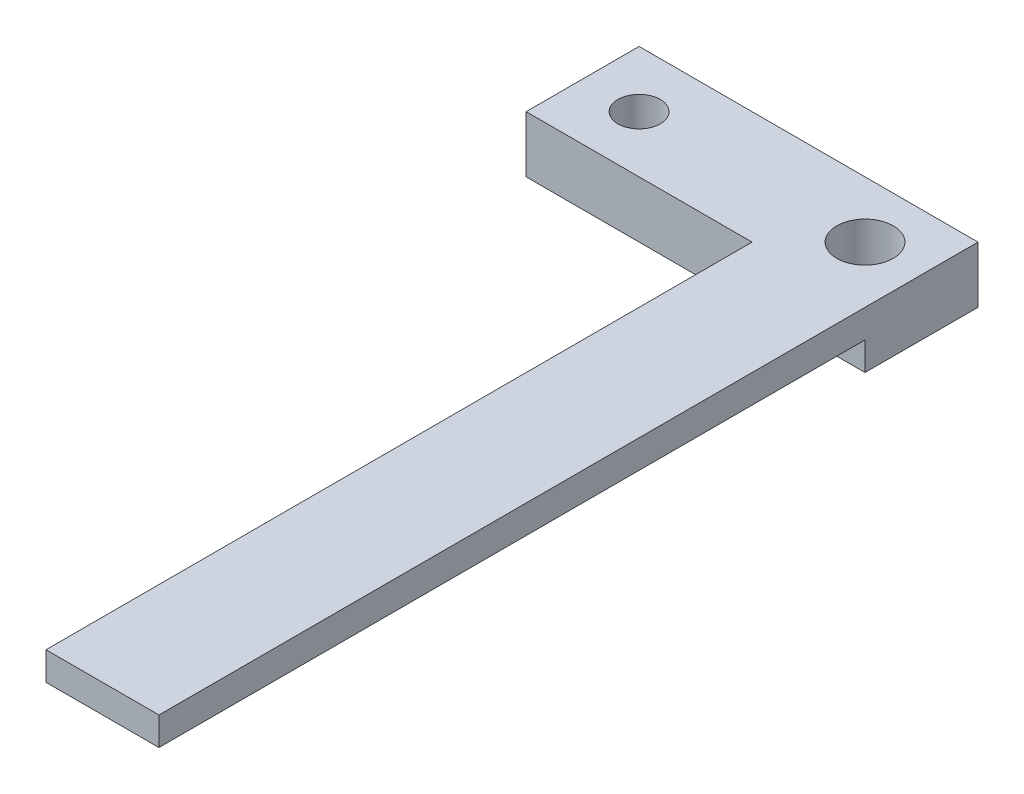
ISO-10303-21;
HEADER;
FILE_DESCRIPTION(('STEP AP214'),'2;1');
FILE_NAME('part.step','',(''),(''),'','','');
FILE_SCHEMA(('AUTOMOTIVE_DESIGN { 1 0 10303 214 1 1 1 1 }'));
ENDSEC;
DATA;
#1=APPLICATION_CONTEXT('core data for automotive mechanical design processes');
#2=APPLICATION_PROTOCOL_DEFINITION('international standard','automotive_design',2000,#1);
#3=PRODUCT_CONTEXT('',#1,'mechanical');
#4=PRODUCT('Part','Part','',(#3));
#5=PRODUCT_RELATED_PRODUCT_CATEGORY('part','',(#4));
#6=PRODUCT_DEFINITION_FORMATION('','',#4);
#7=PRODUCT_DEFINITION_CONTEXT('part definition',#1,'design');
#8=PRODUCT_DEFINITION('design','',#6,#7);
#9=PRODUCT_DEFINITION_SHAPE('','',#8);
#10=(LENGTH_UNIT() NAMED_UNIT(*) SI_UNIT(.MILLI.,.METRE.));
#11=(NAMED_UNIT(*) PLANE_ANGLE_UNIT() SI_UNIT($,.RADIAN.));
#12=(NAMED_UNIT(*) SI_UNIT($,.STERADIAN.) SOLID_ANGLE_UNIT());
#13=UNCERTAINTY_MEASURE_WITH_UNIT(LENGTH_MEASURE(1.E-05),#10,'distance_accuracy_value','');
#14=(GEOMETRIC_REPRESENTATION_CONTEXT(3) GLOBAL_UNCERTAINTY_ASSIGNED_CONTEXT((#13)) GLOBAL_UNIT_ASSIGNED_CONTEXT((#10,
#11,#12)) REPRESENTATION_CONTEXT('',''));
#15=CARTESIAN_POINT('',(0.,0.,0.));
#16=DIRECTION('',(0.,0.,1.));
#17=DIRECTION('',(1.,0.,0.));
#18=AXIS2_PLACEMENT_3D('',#15,#16,#17);
#19=CARTESIAN_POINT('',(-60.,20.,20.));
#20=DIRECTION('',(0.,0.,-1.));
#21=DIRECTION('',(-1.,0.,0.));
#22=AXIS2_PLACEMENT_3D('',#19,#20,#21);
#23=PLANE('',#22);
#24=DIRECTION('',(1.,0.,0.));
#25=VECTOR('',#24,1.);
#26=CARTESIAN_POINT('',(20.,10.,20.));
#27=LINE('',#26,#25);
#28=CARTESIAN_POINT('',(20.,10.,20.));
#29=VERTEX_POINT('',#28);
#30=CARTESIAN_POINT('',(60.,10.,20.));
#31=VERTEX_POINT('',#30);
#32=EDGE_CURVE('E132',#29,#31,#27,.T.);
#33=ORIENTED_EDGE('',*,*,#32,.F.);
#34=DIRECTION('',(0.,-1.,0.));
#35=VECTOR('',#34,1.);
#36=CARTESIAN_POINT('',(20.,10.,20.));
#37=LINE('',#36,#35);
#38=CARTESIAN_POINT('',(20.,20.,20.));
#39=VERTEX_POINT('',#38);
#40=EDGE_CURVE('E60',#39,#29,#37,.T.);
#41=ORIENTED_EDGE('',*,*,#40,.F.);
#42=DIRECTION('',(1.,0.,0.));
#43=VECTOR('',#42,1.);
#44=CARTESIAN_POINT('',(-60.,20.,20.));
#45=LINE('',#44,#43);
#46=CARTESIAN_POINT('',(-60.,20.,20.));
#47=VERTEX_POINT('',#46);
#48=EDGE_CURVE('E182',#47,#39,#45,.T.);
#49=ORIENTED_EDGE('',*,*,#48,.F.);
#50=DIRECTION('',(0.,-1.,0.));
#51=VECTOR('',#50,1.);
#52=CARTESIAN_POINT('',(-60.,20.,20.));
#53=LINE('',#52,#51);
#54=CARTESIAN_POINT('',(-60.,0.,20.));
#55=VERTEX_POINT('',#54);
#56=EDGE_CURVE('E197',#47,#55,#53,.T.);
#57=ORIENTED_EDGE('',*,*,#56,.T.);
#58=DIRECTION('',(1.,0.,0.));
#59=VECTOR('',#58,1.);
#60=CARTESIAN_POINT('',(-60.,0.,20.));
#61=LINE('',#60,#59);
#62=CARTESIAN_POINT('',(60.,0.,20.));
#63=VERTEX_POINT('',#62);
#64=EDGE_CURVE('E114',#55,#63,#61,.T.);
#65=ORIENTED_EDGE('',*,*,#64,.T.);
#66=DIRECTION('',(0.,-1.,0.));
#67=VECTOR('',#66,1.);
#68=CARTESIAN_POINT('',(60.,20.,20.));
#69=LINE('',#68,#67);
#70=EDGE_CURVE('E66',#31,#63,#69,.T.);
#71=ORIENTED_EDGE('',*,*,#70,.F.);
#72=EDGE_LOOP('',(#33,#41,#49,#57,#65,#71));
#73=FACE_BOUND('',#72,.T.);
#74=ADVANCED_FACE('F44',(#73),#23,.F.);
#75=CARTESIAN_POINT('',(0.,0.,0.));
#76=DIRECTION('',(0.,-1.,0.));
#77=DIRECTION('',(0.,0.,-1.));
#78=AXIS2_PLACEMENT_3D('',#75,#76,#77);
#79=PLANE('',#78);
#80=CARTESIAN_POINT('',(40.,0.,0.));
#81=DIRECTION('',(0.,1.,0.));
#82=DIRECTION('',(0.,0.,1.));
#83=AXIS2_PLACEMENT_3D('',#80,#81,#82);
#84=CIRCLE('',#83,10.);
#85=CARTESIAN_POINT('',(40.,0.,10.));
#86=VERTEX_POINT('',#85);
#87=EDGE_CURVE('E161',#86,#86,#84,.T.);
#88=ORIENTED_EDGE('',*,*,#87,.T.);
#89=EDGE_LOOP('',(#88));
#90=FACE_BOUND('',#89,.T.);
#91=DIRECTION('',(0.,0.,-1.));
#92=VECTOR('',#91,1.);
#93=CARTESIAN_POINT('',(60.,0.,20.));
#94=LINE('',#93,#92);
#95=CARTESIAN_POINT('',(60.,0.,-20.));
#96=VERTEX_POINT('',#95);
#97=EDGE_CURVE('E175',#63,#96,#94,.T.);
#98=ORIENTED_EDGE('',*,*,#97,.F.);
#99=ORIENTED_EDGE('',*,*,#64,.F.);
#100=DIRECTION('',(0.,0.,1.));
#101=VECTOR('',#100,1.);
#102=CARTESIAN_POINT('',(-60.,0.,20.));
#103=LINE('',#102,#101);
#104=CARTESIAN_POINT('',(-60.,0.,-20.));
#105=VERTEX_POINT('',#104);
#106=EDGE_CURVE('E190',#105,#55,#103,.T.);
#107=ORIENTED_EDGE('',*,*,#106,.F.);
#108=DIRECTION('',(-1.,0.,0.));
#109=VECTOR('',#108,1.);
#110=CARTESIAN_POINT('',(-60.,0.,-20.));
#111=LINE('',#110,#109);
#112=EDGE_CURVE('E187',#96,#105,#111,.T.);
#113=ORIENTED_EDGE('',*,*,#112,.F.);
#114=EDGE_LOOP('',(#98,#99,#107,#113));
#115=FACE_BOUND('',#114,.T.);
#116=CARTESIAN_POINT('',(-40.,0.,0.));
#117=DIRECTION('',(0.,-1.,0.));
#118=DIRECTION('',(0.,0.,-1.));
#119=AXIS2_PLACEMENT_3D('',#116,#117,#118);
#120=CIRCLE('',#119,10.);
#121=CARTESIAN_POINT('',(-40.,0.,-10.));
#122=VERTEX_POINT('',#121);
#123=EDGE_CURVE('E156',#122,#122,#120,.T.);
#124=ORIENTED_EDGE('',*,*,#123,.F.);
#125=EDGE_LOOP('',(#124));
#126=FACE_BOUND('',#125,.T.);
#127=ADVANCED_FACE('F212',(#90,#115,#126),#79,.T.);
#128=CARTESIAN_POINT('',(0.,20.,0.));
#129=DIRECTION('',(0.,-1.,0.));
#130=DIRECTION('',(0.,0.,-1.));
#131=AXIS2_PLACEMENT_3D('',#128,#129,#130);
#132=PLANE('',#131);
#133=DIRECTION('',(0.,0.,-1.));
#134=VECTOR('',#133,1.);
#135=CARTESIAN_POINT('',(60.,20.,20.));
#136=LINE('',#135,#134);
#137=CARTESIAN_POINT('',(60.,20.,270.));
#138=VERTEX_POINT('',#137);
#139=CARTESIAN_POINT('',(60.,20.,-20.));
#140=VERTEX_POINT('',#139);
#141=EDGE_CURVE('E105',#138,#140,#136,.T.);
#142=ORIENTED_EDGE('',*,*,#141,.T.);
#143=DIRECTION('',(-1.,0.,0.));
#144=VECTOR('',#143,1.);
#145=CARTESIAN_POINT('',(-60.,20.,-20.));
#146=LINE('',#145,#144);
#147=CARTESIAN_POINT('',(-60.,20.,-20.));
#148=VERTEX_POINT('',#147);
#149=EDGE_CURVE('E113',#140,#148,#146,.T.);
#150=ORIENTED_EDGE('',*,*,#149,.T.);
#151=DIRECTION('',(0.,0.,1.));
#152=VECTOR('',#151,1.);
#153=CARTESIAN_POINT('',(-60.,20.,20.));
#154=LINE('',#153,#152);
#155=EDGE_CURVE('E179',#148,#47,#154,.T.);
#156=ORIENTED_EDGE('',*,*,#155,.T.);
#157=ORIENTED_EDGE('',*,*,#48,.T.);
#158=DIRECTION('',(0.,0.,-1.));
#159=VECTOR('',#158,1.);
#160=CARTESIAN_POINT('',(20.,20.,270.));
#161=LINE('',#160,#159);
#162=CARTESIAN_POINT('',(20.,20.,270.));
#163=VERTEX_POINT('',#162);
#164=EDGE_CURVE('E121',#163,#39,#161,.T.);
#165=ORIENTED_EDGE('',*,*,#164,.F.);
#166=DIRECTION('',(-1.,0.,0.));
#167=VECTOR('',#166,1.);
#168=CARTESIAN_POINT('',(20.,20.,270.));
#169=LINE('',#168,#167);
#170=EDGE_CURVE('E117',#138,#163,#169,.T.);
#171=ORIENTED_EDGE('',*,*,#170,.F.);
#172=EDGE_LOOP('',(#142,#150,#156,#157,#165,#171));
#173=FACE_BOUND('',#172,.T.);
#174=CARTESIAN_POINT('',(-40.,20.,0.));
#175=DIRECTION('',(0.,1.,0.));
#176=DIRECTION('',(0.,0.,1.));
#177=AXIS2_PLACEMENT_3D('',#174,#175,#176);
#178=CIRCLE('',#177,7.50000000000001);
#179=CARTESIAN_POINT('',(-40.,20.,7.50000000000001));
#180=VERTEX_POINT('',#179);
#181=EDGE_CURVE('E169',#180,#180,#178,.T.);
#182=ORIENTED_EDGE('',*,*,#181,.F.);
#183=EDGE_LOOP('',(#182));
#184=FACE_BOUND('',#183,.T.);
#185=CARTESIAN_POINT('',(40.,20.,0.));
#186=DIRECTION('',(0.,1.,0.));
#187=DIRECTION('',(0.,0.,1.));
#188=AXIS2_PLACEMENT_3D('',#185,#186,#187);
#189=CIRCLE('',#188,10.);
#190=CARTESIAN_POINT('',(40.,20.,10.));
#191=VERTEX_POINT('',#190);
#192=EDGE_CURVE('E165',#191,#191,#189,.T.);
#193=ORIENTED_EDGE('',*,*,#192,.F.);
#194=EDGE_LOOP('',(#193));
#195=FACE_BOUND('',#194,.T.);
#196=ADVANCED_FACE('F118',(#173,#184,#195),#132,.F.);
#197=CARTESIAN_POINT('',(60.,20.,20.));
#198=DIRECTION('',(-1.,0.,0.));
#199=DIRECTION('',(0.,0.,1.));
#200=AXIS2_PLACEMENT_3D('',#197,#198,#199);
#201=PLANE('',#200);
#202=ORIENTED_EDGE('',*,*,#97,.T.);
#203=DIRECTION('',(0.,-1.,0.));
#204=VECTOR('',#203,1.);
#205=CARTESIAN_POINT('',(60.,20.,-20.));
#206=LINE('',#205,#204);
#207=EDGE_CURVE('E11',#140,#96,#206,.T.);
#208=ORIENTED_EDGE('',*,*,#207,.F.);
#209=ORIENTED_EDGE('',*,*,#141,.F.);
#210=DIRECTION('',(0.,1.,0.));
#211=VECTOR('',#210,1.);
#212=CARTESIAN_POINT('',(60.,10.,270.));
#213=LINE('',#212,#211);
#214=CARTESIAN_POINT('',(60.,10.,270.));
#215=VERTEX_POINT('',#214);
#216=EDGE_CURVE('E110',#215,#138,#213,.T.);
#217=ORIENTED_EDGE('',*,*,#216,.F.);
#218=DIRECTION('',(0.,0.,-1.));
#219=VECTOR('',#218,1.);
#220=CARTESIAN_POINT('',(60.,10.,270.));
#221=LINE('',#220,#219);
#222=EDGE_CURVE('E141',#215,#31,#221,.T.);
#223=ORIENTED_EDGE('',*,*,#222,.T.);
#224=ORIENTED_EDGE('',*,*,#70,.T.);
#225=EDGE_LOOP('',(#202,#208,#209,#217,#223,#224));
#226=FACE_BOUND('',#225,.T.);
#227=ADVANCED_FACE('F46',(#226),#201,.F.);
#228=CARTESIAN_POINT('',(-60.,20.,-20.));
#229=DIRECTION('',(0.,0.,1.));
#230=DIRECTION('',(1.,0.,0.));
#231=AXIS2_PLACEMENT_3D('',#228,#229,#230);
#232=PLANE('',#231);
#233=ORIENTED_EDGE('',*,*,#112,.T.);
#234=DIRECTION('',(0.,-1.,0.));
#235=VECTOR('',#234,1.);
#236=CARTESIAN_POINT('',(-60.,20.,-20.));
#237=LINE('',#236,#235);
#238=EDGE_CURVE('E53',#148,#105,#237,.T.);
#239=ORIENTED_EDGE('',*,*,#238,.F.);
#240=ORIENTED_EDGE('',*,*,#149,.F.);
#241=ORIENTED_EDGE('',*,*,#207,.T.);
#242=EDGE_LOOP('',(#233,#239,#240,#241));
#243=FACE_BOUND('',#242,.T.);
#244=ADVANCED_FACE('F239',(#243),#232,.F.);
#245=CARTESIAN_POINT('',(-60.,20.,20.));
#246=DIRECTION('',(1.,0.,0.));
#247=DIRECTION('',(0.,0.,-1.));
#248=AXIS2_PLACEMENT_3D('',#245,#246,#247);
#249=PLANE('',#248);
#250=ORIENTED_EDGE('',*,*,#106,.T.);
#251=ORIENTED_EDGE('',*,*,#56,.F.);
#252=ORIENTED_EDGE('',*,*,#155,.F.);
#253=ORIENTED_EDGE('',*,*,#238,.T.);
#254=EDGE_LOOP('',(#250,#251,#252,#253));
#255=FACE_BOUND('',#254,.T.);
#256=ADVANCED_FACE('F206',(#255),#249,.F.);
#257=CARTESIAN_POINT('',(-40.,20.,0.));
#258=DIRECTION('',(0.,-1.,0.));
#259=DIRECTION('',(0.,0.,-1.));
#260=AXIS2_PLACEMENT_3D('',#257,#258,#259);
#261=CYLINDRICAL_SURFACE('',#260,7.50000000000001);
#262=ORIENTED_EDGE('',*,*,#181,.T.);
#263=EDGE_LOOP('',(#262));
#264=FACE_BOUND('',#263,.T.);
#265=CARTESIAN_POINT('',(-40.,-10.,0.));
#266=DIRECTION('',(0.,-1.,0.));
#267=DIRECTION('',(0.,0.,-1.));
#268=AXIS2_PLACEMENT_3D('',#265,#266,#267);
#269=CIRCLE('',#268,7.50000000000001);
#270=CARTESIAN_POINT('',(-40.,-10.,-7.50000000000001));
#271=VERTEX_POINT('',#270);
#272=EDGE_CURVE('E152',#271,#271,#269,.T.);
#273=ORIENTED_EDGE('',*,*,#272,.T.);
#274=EDGE_LOOP('',(#273));
#275=FACE_BOUND('',#274,.T.);
#276=ADVANCED_FACE('F238',(#264,#275),#261,.F.);
#277=CARTESIAN_POINT('',(40.,20.,0.));
#278=DIRECTION('',(0.,-1.,0.));
#279=DIRECTION('',(0.,0.,-1.));
#280=AXIS2_PLACEMENT_3D('',#277,#278,#279);
#281=CYLINDRICAL_SURFACE('',#280,10.);
#282=ORIENTED_EDGE('',*,*,#192,.T.);
#283=EDGE_LOOP('',(#282));
#284=FACE_BOUND('',#283,.T.);
#285=ORIENTED_EDGE('',*,*,#87,.F.);
#286=EDGE_LOOP('',(#285));
#287=FACE_BOUND('',#286,.T.);
#288=ADVANCED_FACE('F252',(#284,#287),#281,.F.);
#289=CARTESIAN_POINT('',(-40.,-10.,0.));
#290=DIRECTION('',(0.,-1.,0.));
#291=DIRECTION('',(0.,0.,-1.));
#292=AXIS2_PLACEMENT_3D('',#289,#290,#291);
#293=PLANE('',#292);
#294=CARTESIAN_POINT('',(-40.,-10.,0.));
#295=DIRECTION('',(0.,-1.,0.));
#296=DIRECTION('',(0.,0.,-1.));
#297=AXIS2_PLACEMENT_3D('',#294,#295,#296);
#298=CIRCLE('',#297,10.);
#299=CARTESIAN_POINT('',(-40.,-10.,-10.));
#300=VERTEX_POINT('',#299);
#301=EDGE_CURVE('E157',#300,#300,#298,.T.);
#302=ORIENTED_EDGE('',*,*,#301,.T.);
#303=EDGE_LOOP('',(#302));
#304=FACE_BOUND('',#303,.T.);
#305=ORIENTED_EDGE('',*,*,#272,.F.);
#306=EDGE_LOOP('',(#305));
#307=FACE_BOUND('',#306,.T.);
#308=ADVANCED_FACE('F256',(#304,#307),#293,.T.);
#309=CARTESIAN_POINT('',(-40.,-10.,0.));
#310=DIRECTION('',(0.,1.,0.));
#311=DIRECTION('',(0.,0.,1.));
#312=AXIS2_PLACEMENT_3D('',#309,#310,#311);
#313=CYLINDRICAL_SURFACE('',#312,10.);
#314=ORIENTED_EDGE('',*,*,#301,.F.);
#315=EDGE_LOOP('',(#314));
#316=FACE_BOUND('',#315,.T.);
#317=ORIENTED_EDGE('',*,*,#123,.T.);
#318=EDGE_LOOP('',(#317));
#319=FACE_BOUND('',#318,.T.);
#320=ADVANCED_FACE('F226',(#316,#319),#313,.T.);
#321=CARTESIAN_POINT('',(20.,10.,270.));
#322=DIRECTION('',(1.,0.,0.));
#323=DIRECTION('',(0.,0.,-1.));
#324=AXIS2_PLACEMENT_3D('',#321,#322,#323);
#325=PLANE('',#324);
#326=ORIENTED_EDGE('',*,*,#40,.T.);
#327=DIRECTION('',(0.,0.,-1.));
#328=VECTOR('',#327,1.);
#329=CARTESIAN_POINT('',(20.,10.,270.));
#330=LINE('',#329,#328);
#331=CARTESIAN_POINT('',(20.,10.,270.));
#332=VERTEX_POINT('',#331);
#333=EDGE_CURVE('E146',#332,#29,#330,.T.);
#334=ORIENTED_EDGE('',*,*,#333,.F.);
#335=DIRECTION('',(0.,-1.,0.));
#336=VECTOR('',#335,1.);
#337=CARTESIAN_POINT('',(20.,10.,270.));
#338=LINE('',#337,#336);
#339=EDGE_CURVE('E125',#163,#332,#338,.T.);
#340=ORIENTED_EDGE('',*,*,#339,.F.);
#341=ORIENTED_EDGE('',*,*,#164,.T.);
#342=EDGE_LOOP('',(#326,#334,#340,#341));
#343=FACE_BOUND('',#342,.T.);
#344=ADVANCED_FACE('F215',(#343),#325,.F.);
#345=CARTESIAN_POINT('',(20.,10.,270.));
#346=DIRECTION('',(0.,1.,0.));
#347=DIRECTION('',(0.,0.,1.));
#348=AXIS2_PLACEMENT_3D('',#345,#346,#347);
#349=PLANE('',#348);
#350=ORIENTED_EDGE('',*,*,#32,.T.);
#351=ORIENTED_EDGE('',*,*,#222,.F.);
#352=DIRECTION('',(1.,0.,0.));
#353=VECTOR('',#352,1.);
#354=CARTESIAN_POINT('',(20.,10.,270.));
#355=LINE('',#354,#353);
#356=EDGE_CURVE('E129',#332,#215,#355,.T.);
#357=ORIENTED_EDGE('',*,*,#356,.F.);
#358=ORIENTED_EDGE('',*,*,#333,.T.);
#359=EDGE_LOOP('',(#350,#351,#357,#358));
#360=FACE_BOUND('',#359,.T.);
#361=ADVANCED_FACE('F218',(#360),#349,.F.);
#362=CARTESIAN_POINT('',(0.,0.,270.));
#363=DIRECTION('',(0.,0.,-1.));
#364=DIRECTION('',(-1.,0.,0.));
#365=AXIS2_PLACEMENT_3D('',#362,#363,#364);
#366=PLANE('',#365);
#367=ORIENTED_EDGE('',*,*,#216,.T.);
#368=ORIENTED_EDGE('',*,*,#170,.T.);
#369=ORIENTED_EDGE('',*,*,#339,.T.);
#370=ORIENTED_EDGE('',*,*,#356,.T.);
#371=EDGE_LOOP('',(#367,#368,#369,#370));
#372=FACE_BOUND('',#371,.T.);
#373=ADVANCED_FACE('F127',(#372),#366,.F.);
#374=CLOSED_SHELL('',(#74,#127,#196,#227,#244,#256,#276,#288,#308,#320,#344,#361,#373));
#375=MANIFOLD_SOLID_BREP('B2',#374);
#376=ADVANCED_BREP_SHAPE_REPRESENTATION('',(#18,#375),#14);
#377=SHAPE_DEFINITION_REPRESENTATION(#9,#376);
ENDSEC;
END-ISO-10303-21;
